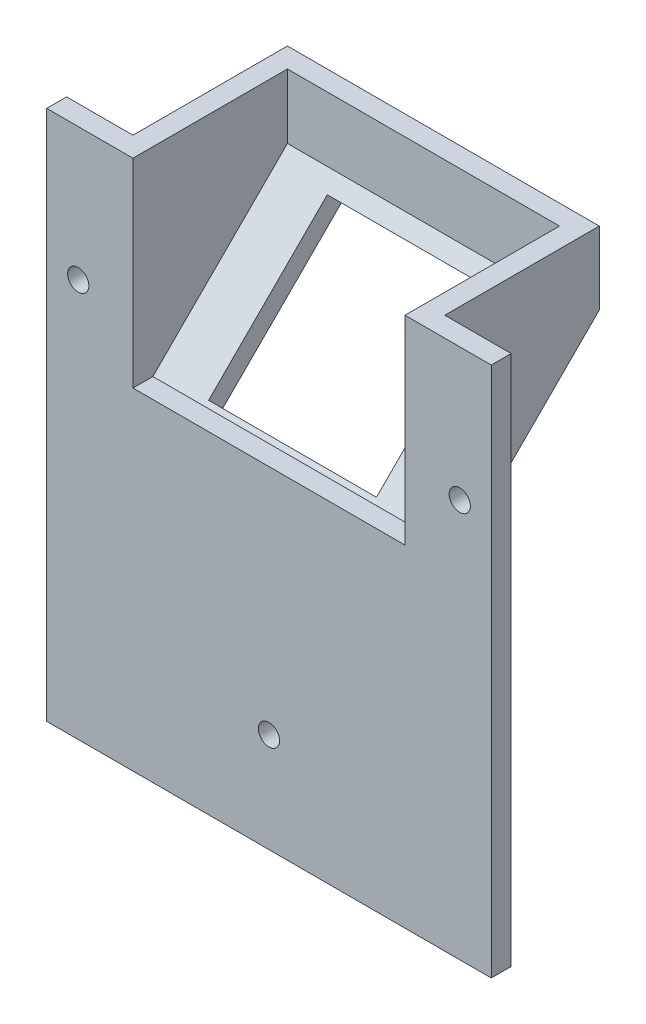
ISO-10303-21;
HEADER;
FILE_DESCRIPTION(('STEP AP214'),'2;1');
FILE_NAME('part.step','',(''),(''),'','','');
FILE_SCHEMA(('AUTOMOTIVE_DESIGN { 1 0 10303 214 1 1 1 1 }'));
ENDSEC;
DATA;
#1=APPLICATION_CONTEXT('core data for automotive mechanical design processes');
#2=APPLICATION_PROTOCOL_DEFINITION('international standard','automotive_design',2000,#1);
#3=PRODUCT_CONTEXT('',#1,'mechanical');
#4=PRODUCT('Part','Part','',(#3));
#5=PRODUCT_RELATED_PRODUCT_CATEGORY('part','',(#4));
#6=PRODUCT_DEFINITION_FORMATION('','',#4);
#7=PRODUCT_DEFINITION_CONTEXT('part definition',#1,'design');
#8=PRODUCT_DEFINITION('design','',#6,#7);
#9=PRODUCT_DEFINITION_SHAPE('','',#8);
#10=(LENGTH_UNIT() NAMED_UNIT(*) SI_UNIT(.MILLI.,.METRE.));
#11=(NAMED_UNIT(*) PLANE_ANGLE_UNIT() SI_UNIT($,.RADIAN.));
#12=(NAMED_UNIT(*) SI_UNIT($,.STERADIAN.) SOLID_ANGLE_UNIT());
#13=UNCERTAINTY_MEASURE_WITH_UNIT(LENGTH_MEASURE(1.E-05),#10,'distance_accuracy_value','');
#14=(GEOMETRIC_REPRESENTATION_CONTEXT(3) GLOBAL_UNCERTAINTY_ASSIGNED_CONTEXT((#13)) GLOBAL_UNIT_ASSIGNED_CONTEXT((#10,
#11,#12)) REPRESENTATION_CONTEXT('',''));
#15=CARTESIAN_POINT('',(0.,0.,0.));
#16=DIRECTION('',(0.,0.,1.));
#17=DIRECTION('',(1.,0.,0.));
#18=AXIS2_PLACEMENT_3D('',#15,#16,#17);
#19=CARTESIAN_POINT('',(13.,0.,0.));
#20=DIRECTION('',(1.,0.,0.));
#21=DIRECTION('',(0.,1.,0.));
#22=AXIS2_PLACEMENT_3D('',#19,#20,#21);
#23=PLANE('',#22);
#24=DIRECTION('',(0.,1.,0.));
#25=VECTOR('',#24,1.);
#26=CARTESIAN_POINT('',(13.,0.,3.));
#27=LINE('',#26,#25);
#28=CARTESIAN_POINT('',(13.,50.,3.));
#29=VERTEX_POINT('',#28);
#30=CARTESIAN_POINT('',(13.,80.,3.));
#31=VERTEX_POINT('',#30);
#32=EDGE_CURVE('E326',#29,#31,#27,.T.);
#33=ORIENTED_EDGE('',*,*,#32,.F.);
#34=DIRECTION('',(0.,0.,-1.));
#35=VECTOR('',#34,1.);
#36=CARTESIAN_POINT('',(13.,50.,0.));
#37=LINE('',#36,#35);
#38=CARTESIAN_POINT('',(13.,50.,0.));
#39=VERTEX_POINT('',#38);
#40=EDGE_CURVE('E301',#29,#39,#37,.T.);
#41=ORIENTED_EDGE('',*,*,#40,.T.);
#42=DIRECTION('',(0.,-0.707106781186557,0.707106781186538));
#43=VECTOR('',#42,1.);
#44=CARTESIAN_POINT('',(13.,70.2805625520103,-20.2805625520097));
#45=LINE('',#44,#43);
#46=CARTESIAN_POINT('',(13.,70.2805625520103,-20.2805625520097));
#47=VERTEX_POINT('',#46);
#48=EDGE_CURVE('E308',#47,#39,#45,.T.);
#49=ORIENTED_EDGE('',*,*,#48,.F.);
#50=DIRECTION('',(0.,-1.,0.));
#51=VECTOR('',#50,1.);
#52=CARTESIAN_POINT('',(13.,80.,-20.2805625520097));
#53=LINE('',#52,#51);
#54=CARTESIAN_POINT('',(13.,80.,-20.2805625520097));
#55=VERTEX_POINT('',#54);
#56=EDGE_CURVE('E305',#55,#47,#53,.T.);
#57=ORIENTED_EDGE('',*,*,#56,.F.);
#58=DIRECTION('',(0.,0.,-1.));
#59=VECTOR('',#58,1.);
#60=CARTESIAN_POINT('',(13.,80.,0.));
#61=LINE('',#60,#59);
#62=EDGE_CURVE('E328',#31,#55,#61,.T.);
#63=ORIENTED_EDGE('',*,*,#62,.F.);
#64=EDGE_LOOP('',(#33,#41,#49,#57,#63));
#65=FACE_BOUND('',#64,.T.);
#66=ADVANCED_FACE('F82',(#65),#23,.T.);
#67=CARTESIAN_POINT('',(13.,0.,3.));
#68=DIRECTION('',(0.,0.,1.));
#69=DIRECTION('',(1.,0.,0.));
#70=AXIS2_PLACEMENT_3D('',#67,#68,#69);
#71=PLANE('',#70);
#72=CARTESIAN_POINT('',(4.75,60.,3.));
#73=DIRECTION('',(0.,0.,1.));
#74=DIRECTION('',(1.,0.,0.));
#75=AXIS2_PLACEMENT_3D('',#72,#73,#74);
#76=CIRCLE('',#75,1.6);
#77=CARTESIAN_POINT('',(6.35,60.,3.));
#78=VERTEX_POINT('',#77);
#79=EDGE_CURVE('E227',#78,#78,#76,.T.);
#80=ORIENTED_EDGE('',*,*,#79,.F.);
#81=EDGE_LOOP('',(#80));
#82=FACE_BOUND('',#81,.T.);
#83=CARTESIAN_POINT('',(33.5,15.,3.));
#84=DIRECTION('',(0.,0.,1.));
#85=DIRECTION('',(1.,0.,0.));
#86=AXIS2_PLACEMENT_3D('',#83,#84,#85);
#87=CIRCLE('',#86,1.6);
#88=CARTESIAN_POINT('',(35.1,15.,3.));
#89=VERTEX_POINT('',#88);
#90=EDGE_CURVE('E233',#89,#89,#87,.T.);
#91=ORIENTED_EDGE('',*,*,#90,.F.);
#92=EDGE_LOOP('',(#91));
#93=FACE_BOUND('',#92,.T.);
#94=CARTESIAN_POINT('',(62.25,60.,3.));
#95=DIRECTION('',(0.,0.,1.));
#96=DIRECTION('',(1.,0.,0.));
#97=AXIS2_PLACEMENT_3D('',#94,#95,#96);
#98=CIRCLE('',#97,1.6);
#99=CARTESIAN_POINT('',(63.85,60.,3.));
#100=VERTEX_POINT('',#99);
#101=EDGE_CURVE('E239',#100,#100,#98,.T.);
#102=ORIENTED_EDGE('',*,*,#101,.F.);
#103=EDGE_LOOP('',(#102));
#104=FACE_BOUND('',#103,.T.);
#105=DIRECTION('',(-1.,0.,0.));
#106=VECTOR('',#105,1.);
#107=CARTESIAN_POINT('',(9.99999999999998,50.,3.));
#108=LINE('',#107,#106);
#109=CARTESIAN_POINT('',(54.,50.,3.));
#110=VERTEX_POINT('',#109);
#111=EDGE_CURVE('E271',#110,#29,#108,.T.);
#112=ORIENTED_EDGE('',*,*,#111,.T.);
#113=ORIENTED_EDGE('',*,*,#32,.T.);
#114=DIRECTION('',(-1.,0.,0.));
#115=VECTOR('',#114,1.);
#116=CARTESIAN_POINT('',(13.,80.,3.));
#117=LINE('',#116,#115);
#118=CARTESIAN_POINT('',(0.,80.,3.));
#119=VERTEX_POINT('',#118);
#120=EDGE_CURVE('E312',#31,#119,#117,.T.);
#121=ORIENTED_EDGE('',*,*,#120,.T.);
#122=DIRECTION('',(0.,-1.,0.));
#123=VECTOR('',#122,1.);
#124=CARTESIAN_POINT('',(0.,0.,3.));
#125=LINE('',#124,#123);
#126=CARTESIAN_POINT('',(0.,0.,3.));
#127=VERTEX_POINT('',#126);
#128=EDGE_CURVE('E262',#119,#127,#125,.T.);
#129=ORIENTED_EDGE('',*,*,#128,.T.);
#130=DIRECTION('',(1.,0.,0.));
#131=VECTOR('',#130,1.);
#132=CARTESIAN_POINT('',(67.,0.,3.));
#133=LINE('',#132,#131);
#134=CARTESIAN_POINT('',(67.,0.,3.));
#135=VERTEX_POINT('',#134);
#136=EDGE_CURVE('E264',#127,#135,#133,.T.);
#137=ORIENTED_EDGE('',*,*,#136,.T.);
#138=DIRECTION('',(0.,1.,0.));
#139=VECTOR('',#138,1.);
#140=CARTESIAN_POINT('',(67.,0.,3.));
#141=LINE('',#140,#139);
#142=CARTESIAN_POINT('',(67.,80.,3.));
#143=VERTEX_POINT('',#142);
#144=EDGE_CURVE('E267',#135,#143,#141,.T.);
#145=ORIENTED_EDGE('',*,*,#144,.T.);
#146=DIRECTION('',(-1.,0.,0.));
#147=VECTOR('',#146,1.);
#148=CARTESIAN_POINT('',(67.,80.,3.));
#149=LINE('',#148,#147);
#150=CARTESIAN_POINT('',(54.,80.,3.));
#151=VERTEX_POINT('',#150);
#152=EDGE_CURVE('E269',#143,#151,#149,.T.);
#153=ORIENTED_EDGE('',*,*,#152,.T.);
#154=DIRECTION('',(0.,1.,0.));
#155=VECTOR('',#154,1.);
#156=CARTESIAN_POINT('',(54.,45.757359312881,3.));
#157=LINE('',#156,#155);
#158=EDGE_CURVE('E246',#110,#151,#157,.T.);
#159=ORIENTED_EDGE('',*,*,#158,.F.);
#160=EDGE_LOOP('',(#112,#113,#121,#129,#137,#145,#153,#159));
#161=FACE_BOUND('',#160,.T.);
#162=ADVANCED_FACE('F84',(#82,#93,#104,#161),#71,.T.);
#163=CARTESIAN_POINT('',(9.99999999999999,0.,0.));
#164=DIRECTION('',(1.,0.,0.));
#165=DIRECTION('',(0.,1.,0.));
#166=AXIS2_PLACEMENT_3D('',#163,#164,#165);
#167=PLANE('',#166);
#168=DIRECTION('',(0.,-0.707106781186551,0.707106781186544));
#169=VECTOR('',#168,1.);
#170=CARTESIAN_POINT('',(9.99999999999999,22.8786796564403,22.8786796564405));
#171=LINE('',#170,#169);
#172=CARTESIAN_POINT('',(9.99999999999998,69.037921864891,-23.2805625520097));
#173=VERTEX_POINT('',#172);
#174=CARTESIAN_POINT('',(9.99999999999998,45.757359312881,0.));
#175=VERTEX_POINT('',#174);
#176=EDGE_CURVE('E333',#173,#175,#171,.T.);
#177=ORIENTED_EDGE('',*,*,#176,.T.);
#178=DIRECTION('',(0.,1.,0.));
#179=VECTOR('',#178,1.);
#180=CARTESIAN_POINT('',(9.99999999999998,80.,0.));
#181=LINE('',#180,#179);
#182=CARTESIAN_POINT('',(9.99999999999998,80.,0.));
#183=VERTEX_POINT('',#182);
#184=EDGE_CURVE('E265',#175,#183,#181,.T.);
#185=ORIENTED_EDGE('',*,*,#184,.T.);
#186=DIRECTION('',(0.,0.,-1.));
#187=VECTOR('',#186,1.);
#188=CARTESIAN_POINT('',(9.99999999999998,80.,0.));
#189=LINE('',#188,#187);
#190=CARTESIAN_POINT('',(9.99999999999998,80.,-23.2805625520097));
#191=VERTEX_POINT('',#190);
#192=EDGE_CURVE('E329',#183,#191,#189,.T.);
#193=ORIENTED_EDGE('',*,*,#192,.T.);
#194=DIRECTION('',(0.,-1.,0.));
#195=VECTOR('',#194,1.);
#196=CARTESIAN_POINT('',(9.99999999999999,0.,-23.2805625520098));
#197=LINE('',#196,#195);
#198=EDGE_CURVE('E336',#191,#173,#197,.T.);
#199=ORIENTED_EDGE('',*,*,#198,.T.);
#200=EDGE_LOOP('',(#177,#185,#193,#199));
#201=FACE_BOUND('',#200,.T.);
#202=ADVANCED_FACE('F376',(#201),#167,.F.);
#203=CARTESIAN_POINT('',(13.,80.,0.));
#204=DIRECTION('',(0.,1.,0.));
#205=DIRECTION('',(-1.,0.,0.));
#206=AXIS2_PLACEMENT_3D('',#203,#204,#205);
#207=PLANE('',#206);
#208=ORIENTED_EDGE('',*,*,#192,.F.);
#209=DIRECTION('',(-1.,0.,0.));
#210=VECTOR('',#209,1.);
#211=CARTESIAN_POINT('',(9.99999999999998,80.,0.));
#212=LINE('',#211,#210);
#213=CARTESIAN_POINT('',(0.,80.,0.));
#214=VERTEX_POINT('',#213);
#215=EDGE_CURVE('E261',#183,#214,#212,.T.);
#216=ORIENTED_EDGE('',*,*,#215,.T.);
#217=DIRECTION('',(0.,0.,-1.));
#218=VECTOR('',#217,1.);
#219=CARTESIAN_POINT('',(0.,80.,3.));
#220=LINE('',#219,#218);
#221=EDGE_CURVE('E298',#119,#214,#220,.T.);
#222=ORIENTED_EDGE('',*,*,#221,.F.);
#223=ORIENTED_EDGE('',*,*,#120,.F.);
#224=ORIENTED_EDGE('',*,*,#62,.T.);
#225=DIRECTION('',(1.,0.,0.));
#226=VECTOR('',#225,1.);
#227=CARTESIAN_POINT('',(-28.4070408742906,80.,-20.2805625520097));
#228=LINE('',#227,#226);
#229=CARTESIAN_POINT('',(54.,80.,-20.2805625520097));
#230=VERTEX_POINT('',#229);
#231=EDGE_CURVE('E318',#55,#230,#228,.T.);
#232=ORIENTED_EDGE('',*,*,#231,.T.);
#233=DIRECTION('',(0.,0.,-1.));
#234=VECTOR('',#233,1.);
#235=CARTESIAN_POINT('',(54.,80.,3.));
#236=LINE('',#235,#234);
#237=EDGE_CURVE('E249',#151,#230,#236,.T.);
#238=ORIENTED_EDGE('',*,*,#237,.F.);
#239=ORIENTED_EDGE('',*,*,#152,.F.);
#240=DIRECTION('',(0.,0.,-1.));
#241=VECTOR('',#240,1.);
#242=CARTESIAN_POINT('',(67.,80.,3.));
#243=LINE('',#242,#241);
#244=CARTESIAN_POINT('',(67.,80.,0.));
#245=VERTEX_POINT('',#244);
#246=EDGE_CURVE('E274',#143,#245,#243,.T.);
#247=ORIENTED_EDGE('',*,*,#246,.T.);
#248=DIRECTION('',(-1.,0.,0.));
#249=VECTOR('',#248,1.);
#250=CARTESIAN_POINT('',(67.,80.,0.));
#251=LINE('',#250,#249);
#252=CARTESIAN_POINT('',(57.,80.,0.));
#253=VERTEX_POINT('',#252);
#254=EDGE_CURVE('E283',#245,#253,#251,.T.);
#255=ORIENTED_EDGE('',*,*,#254,.T.);
#256=DIRECTION('',(0.,0.,-1.));
#257=VECTOR('',#256,1.);
#258=CARTESIAN_POINT('',(57.,80.,3.));
#259=LINE('',#258,#257);
#260=CARTESIAN_POINT('',(57.,80.,-23.2805625520097));
#261=VERTEX_POINT('',#260);
#262=EDGE_CURVE('E245',#253,#261,#259,.T.);
#263=ORIENTED_EDGE('',*,*,#262,.T.);
#264=DIRECTION('',(-1.,0.,0.));
#265=VECTOR('',#264,1.);
#266=CARTESIAN_POINT('',(13.,80.,-23.2805625520097));
#267=LINE('',#266,#265);
#268=EDGE_CURVE('E332',#261,#191,#267,.T.);
#269=ORIENTED_EDGE('',*,*,#268,.T.);
#270=EDGE_LOOP('',(#208,#216,#222,#223,#224,#232,#238,#239,#247,#255,#263,#269));
#271=FACE_BOUND('',#270,.T.);
#272=ADVANCED_FACE('F381',(#271),#207,.T.);
#273=CARTESIAN_POINT('',(13.,0.,-23.2805625520098));
#274=DIRECTION('',(0.,0.,-1.));
#275=DIRECTION('',(0.,1.,0.));
#276=AXIS2_PLACEMENT_3D('',#273,#274,#275);
#277=PLANE('',#276);
#278=ORIENTED_EDGE('',*,*,#198,.F.);
#279=ORIENTED_EDGE('',*,*,#268,.F.);
#280=DIRECTION('',(0.,-1.,0.));
#281=VECTOR('',#280,1.);
#282=CARTESIAN_POINT('',(57.,80.,-23.2805625520097));
#283=LINE('',#282,#281);
#284=CARTESIAN_POINT('',(57.,69.037921864891,-23.2805625520097));
#285=VERTEX_POINT('',#284);
#286=EDGE_CURVE('E255',#261,#285,#283,.T.);
#287=ORIENTED_EDGE('',*,*,#286,.T.);
#288=DIRECTION('',(-1.,0.,0.));
#289=VECTOR('',#288,1.);
#290=CARTESIAN_POINT('',(13.,69.037921864891,-23.2805625520097));
#291=LINE('',#290,#289);
#292=EDGE_CURVE('E342',#285,#173,#291,.T.);
#293=ORIENTED_EDGE('',*,*,#292,.T.);
#294=EDGE_LOOP('',(#278,#279,#287,#293));
#295=FACE_BOUND('',#294,.T.);
#296=ADVANCED_FACE('F390',(#295),#277,.T.);
#297=CARTESIAN_POINT('',(13.,22.8786796564403,22.8786796564405));
#298=DIRECTION('',(0.,-0.707106781186544,-0.707106781186551));
#299=DIRECTION('',(0.,0.707106781186551,-0.707106781186544));
#300=AXIS2_PLACEMENT_3D('',#297,#298,#299);
#301=PLANE('',#300);
#302=DIRECTION('',(0.,0.707106781186551,-0.707106781186544));
#303=VECTOR('',#302,1.);
#304=CARTESIAN_POINT('',(20.85,48.425759193303,-2.66839988042196));
#305=LINE('',#304,#303);
#306=CARTESIAN_POINT('',(20.85,48.425759193303,-2.66839988042196));
#307=VERTEX_POINT('',#306);
#308=CARTESIAN_POINT('',(20.85,66.3155607573228,-20.5582014444415));
#309=VERTEX_POINT('',#308);
#310=EDGE_CURVE('E97',#307,#309,#305,.T.);
#311=ORIENTED_EDGE('',*,*,#310,.F.);
#312=DIRECTION('',(-1.,0.,0.));
#313=VECTOR('',#312,1.);
#314=CARTESIAN_POINT('',(46.15,48.425759193303,-2.66839988042195));
#315=LINE('',#314,#313);
#316=CARTESIAN_POINT('',(46.15,48.425759193303,-2.66839988042195));
#317=VERTEX_POINT('',#316);
#318=EDGE_CURVE('E220',#317,#307,#315,.T.);
#319=ORIENTED_EDGE('',*,*,#318,.F.);
#320=DIRECTION('',(0.,-0.707106781186551,0.707106781186544));
#321=VECTOR('',#320,1.);
#322=CARTESIAN_POINT('',(46.15,48.425759193303,-2.66839988042195));
#323=LINE('',#322,#321);
#324=CARTESIAN_POINT('',(46.15,66.3155607573228,-20.5582014444415));
#325=VERTEX_POINT('',#324);
#326=EDGE_CURVE('E204',#325,#317,#323,.T.);
#327=ORIENTED_EDGE('',*,*,#326,.F.);
#328=DIRECTION('',(1.,0.,0.));
#329=VECTOR('',#328,1.);
#330=CARTESIAN_POINT('',(46.15,66.3155607573228,-20.5582014444415));
#331=LINE('',#330,#329);
#332=EDGE_CURVE('E213',#309,#325,#331,.T.);
#333=ORIENTED_EDGE('',*,*,#332,.F.);
#334=EDGE_LOOP('',(#311,#319,#327,#333));
#335=FACE_BOUND('',#334,.T.);
#336=ORIENTED_EDGE('',*,*,#176,.F.);
#337=ORIENTED_EDGE('',*,*,#292,.F.);
#338=DIRECTION('',(0.,-0.707106781186551,0.707106781186544));
#339=VECTOR('',#338,1.);
#340=CARTESIAN_POINT('',(57.,69.037921864891,-23.2805625520097));
#341=LINE('',#340,#339);
#342=CARTESIAN_POINT('',(57.,45.757359312881,0.));
#343=VERTEX_POINT('',#342);
#344=EDGE_CURVE('E250',#285,#343,#341,.T.);
#345=ORIENTED_EDGE('',*,*,#344,.T.);
#346=DIRECTION('',(-1.,0.,0.));
#347=VECTOR('',#346,1.);
#348=CARTESIAN_POINT('',(13.,45.757359312881,0.));
#349=LINE('',#348,#347);
#350=EDGE_CURVE('E344',#343,#175,#349,.T.);
#351=ORIENTED_EDGE('',*,*,#350,.T.);
#352=EDGE_LOOP('',(#336,#337,#345,#351));
#353=FACE_BOUND('',#352,.T.);
#354=ADVANCED_FACE('F217',(#335,#353),#301,.T.);
#355=CARTESIAN_POINT('',(-28.4070408742906,80.,-20.2805625520097));
#356=DIRECTION('',(0.,0.,-1.));
#357=DIRECTION('',(-1.,0.,0.));
#358=AXIS2_PLACEMENT_3D('',#355,#356,#357);
#359=PLANE('',#358);
#360=ORIENTED_EDGE('',*,*,#231,.F.);
#361=ORIENTED_EDGE('',*,*,#56,.T.);
#362=DIRECTION('',(1.,0.,0.));
#363=VECTOR('',#362,1.);
#364=CARTESIAN_POINT('',(-28.4070408742906,70.2805625520103,-20.2805625520097));
#365=LINE('',#364,#363);
#366=CARTESIAN_POINT('',(54.,70.2805625520103,-20.2805625520097));
#367=VERTEX_POINT('',#366);
#368=EDGE_CURVE('E321',#47,#367,#365,.T.);
#369=ORIENTED_EDGE('',*,*,#368,.T.);
#370=DIRECTION('',(0.,1.,0.));
#371=VECTOR('',#370,1.);
#372=CARTESIAN_POINT('',(54.,80.,-20.2805625520097));
#373=LINE('',#372,#371);
#374=EDGE_CURVE('E315',#367,#230,#373,.T.);
#375=ORIENTED_EDGE('',*,*,#374,.T.);
#376=EDGE_LOOP('',(#360,#361,#369,#375));
#377=FACE_BOUND('',#376,.T.);
#378=ADVANCED_FACE('F397',(#377),#359,.F.);
#379=CARTESIAN_POINT('',(-28.4070408742906,70.2805625520103,-20.2805625520097));
#380=DIRECTION('',(0.,-0.707106781186538,-0.707106781186557));
#381=DIRECTION('',(0.,0.707106781186557,-0.707106781186538));
#382=AXIS2_PLACEMENT_3D('',#379,#380,#381);
#383=PLANE('',#382);
#384=DIRECTION('',(-1.,0.,0.));
#385=VECTOR('',#384,1.);
#386=CARTESIAN_POINT('',(-28.4070408742906,50.5470795368625,-0.547079536862484));
#387=LINE('',#386,#385);
#388=CARTESIAN_POINT('',(46.15,50.5470795368625,-0.547079536862455));
#389=VERTEX_POINT('',#388);
#390=CARTESIAN_POINT('',(20.85,50.5470795368625,-0.547079536862467));
#391=VERTEX_POINT('',#390);
#392=EDGE_CURVE('E90',#389,#391,#387,.T.);
#393=ORIENTED_EDGE('',*,*,#392,.T.);
#394=DIRECTION('',(0.,0.707106781186557,-0.707106781186538));
#395=VECTOR('',#394,1.);
#396=CARTESIAN_POINT('',(20.85,70.2805625520103,-20.2805625520097));
#397=LINE('',#396,#395);
#398=CARTESIAN_POINT('',(20.85,68.4368811008824,-18.4368811008819));
#399=VERTEX_POINT('',#398);
#400=EDGE_CURVE('E12',#391,#399,#397,.T.);
#401=ORIENTED_EDGE('',*,*,#400,.T.);
#402=DIRECTION('',(1.,0.,0.));
#403=VECTOR('',#402,1.);
#404=CARTESIAN_POINT('',(-28.4070408742906,68.4368811008824,-18.4368811008819));
#405=LINE('',#404,#403);
#406=CARTESIAN_POINT('',(46.15,68.4368811008824,-18.4368811008819));
#407=VERTEX_POINT('',#406);
#408=EDGE_CURVE('E347',#399,#407,#405,.T.);
#409=ORIENTED_EDGE('',*,*,#408,.T.);
#410=DIRECTION('',(0.,-0.707106781186557,0.707106781186538));
#411=VECTOR('',#410,1.);
#412=CARTESIAN_POINT('',(46.15,70.2805625520103,-20.2805625520097));
#413=LINE('',#412,#411);
#414=EDGE_CURVE('E207',#407,#389,#413,.T.);
#415=ORIENTED_EDGE('',*,*,#414,.T.);
#416=EDGE_LOOP('',(#393,#401,#409,#415));
#417=FACE_BOUND('',#416,.T.);
#418=ORIENTED_EDGE('',*,*,#368,.F.);
#419=ORIENTED_EDGE('',*,*,#48,.T.);
#420=DIRECTION('',(1.,0.,0.));
#421=VECTOR('',#420,1.);
#422=CARTESIAN_POINT('',(-28.4070408742906,50.,0.));
#423=LINE('',#422,#421);
#424=CARTESIAN_POINT('',(54.,50.,0.));
#425=VERTEX_POINT('',#424);
#426=EDGE_CURVE('E309',#39,#425,#423,.T.);
#427=ORIENTED_EDGE('',*,*,#426,.T.);
#428=DIRECTION('',(0.,0.707106781186557,-0.707106781186538));
#429=VECTOR('',#428,1.);
#430=CARTESIAN_POINT('',(54.,70.2805625520103,-20.2805625520097));
#431=LINE('',#430,#429);
#432=EDGE_CURVE('E304',#425,#367,#431,.T.);
#433=ORIENTED_EDGE('',*,*,#432,.T.);
#434=EDGE_LOOP('',(#418,#419,#427,#433));
#435=FACE_BOUND('',#434,.T.);
#436=ADVANCED_FACE('F354',(#417,#435),#383,.F.);
#437=CARTESIAN_POINT('',(0.,0.,0.));
#438=DIRECTION('',(0.,0.,-1.));
#439=DIRECTION('',(-1.,0.,0.));
#440=AXIS2_PLACEMENT_3D('',#437,#438,#439);
#441=PLANE('',#440);
#442=CARTESIAN_POINT('',(4.75,60.,0.));
#443=DIRECTION('',(0.,0.,-1.));
#444=DIRECTION('',(-1.,0.,0.));
#445=AXIS2_PLACEMENT_3D('',#442,#443,#444);
#446=CIRCLE('',#445,1.6);
#447=CARTESIAN_POINT('',(3.15,60.,0.));
#448=VERTEX_POINT('',#447);
#449=EDGE_CURVE('E232',#448,#448,#446,.T.);
#450=ORIENTED_EDGE('',*,*,#449,.F.);
#451=EDGE_LOOP('',(#450));
#452=FACE_BOUND('',#451,.T.);
#453=CARTESIAN_POINT('',(33.5,15.,0.));
#454=DIRECTION('',(0.,0.,-1.));
#455=DIRECTION('',(-1.,0.,0.));
#456=AXIS2_PLACEMENT_3D('',#453,#454,#455);
#457=CIRCLE('',#456,1.6);
#458=CARTESIAN_POINT('',(31.9,15.,0.));
#459=VERTEX_POINT('',#458);
#460=EDGE_CURVE('E236',#459,#459,#457,.T.);
#461=ORIENTED_EDGE('',*,*,#460,.F.);
#462=EDGE_LOOP('',(#461));
#463=FACE_BOUND('',#462,.T.);
#464=CARTESIAN_POINT('',(62.25,60.,0.));
#465=DIRECTION('',(0.,0.,-1.));
#466=DIRECTION('',(-1.,0.,0.));
#467=AXIS2_PLACEMENT_3D('',#464,#465,#466);
#468=CIRCLE('',#467,1.6);
#469=CARTESIAN_POINT('',(60.65,60.,0.));
#470=VERTEX_POINT('',#469);
#471=EDGE_CURVE('E242',#470,#470,#468,.T.);
#472=ORIENTED_EDGE('',*,*,#471,.F.);
#473=EDGE_LOOP('',(#472));
#474=FACE_BOUND('',#473,.T.);
#475=ORIENTED_EDGE('',*,*,#184,.F.);
#476=ORIENTED_EDGE('',*,*,#350,.F.);
#477=DIRECTION('',(0.,-1.,0.));
#478=VECTOR('',#477,1.);
#479=CARTESIAN_POINT('',(57.,50.,0.));
#480=LINE('',#479,#478);
#481=EDGE_CURVE('E285',#253,#343,#480,.T.);
#482=ORIENTED_EDGE('',*,*,#481,.F.);
#483=ORIENTED_EDGE('',*,*,#254,.F.);
#484=DIRECTION('',(0.,1.,0.));
#485=VECTOR('',#484,1.);
#486=CARTESIAN_POINT('',(67.,0.,0.));
#487=LINE('',#486,#485);
#488=CARTESIAN_POINT('',(67.,0.,0.));
#489=VERTEX_POINT('',#488);
#490=EDGE_CURVE('E281',#489,#245,#487,.T.);
#491=ORIENTED_EDGE('',*,*,#490,.F.);
#492=DIRECTION('',(1.,0.,0.));
#493=VECTOR('',#492,1.);
#494=CARTESIAN_POINT('',(67.,0.,0.));
#495=LINE('',#494,#493);
#496=CARTESIAN_POINT('',(0.,0.,0.));
#497=VERTEX_POINT('',#496);
#498=EDGE_CURVE('E279',#497,#489,#495,.T.);
#499=ORIENTED_EDGE('',*,*,#498,.F.);
#500=DIRECTION('',(0.,-1.,0.));
#501=VECTOR('',#500,1.);
#502=CARTESIAN_POINT('',(0.,0.,0.));
#503=LINE('',#502,#501);
#504=EDGE_CURVE('E277',#214,#497,#503,.T.);
#505=ORIENTED_EDGE('',*,*,#504,.F.);
#506=ORIENTED_EDGE('',*,*,#215,.F.);
#507=EDGE_LOOP('',(#475,#476,#482,#483,#491,#499,#505,#506));
#508=FACE_BOUND('',#507,.T.);
#509=ADVANCED_FACE('F406',(#452,#463,#474,#508),#441,.T.);
#510=CARTESIAN_POINT('',(54.,0.,0.));
#511=DIRECTION('',(-1.,0.,0.));
#512=DIRECTION('',(0.,0.,1.));
#513=AXIS2_PLACEMENT_3D('',#510,#511,#512);
#514=PLANE('',#513);
#515=ORIENTED_EDGE('',*,*,#374,.F.);
#516=ORIENTED_EDGE('',*,*,#432,.F.);
#517=DIRECTION('',(0.,0.,-1.));
#518=VECTOR('',#517,1.);
#519=CARTESIAN_POINT('',(54.,50.,3.));
#520=LINE('',#519,#518);
#521=EDGE_CURVE('E252',#110,#425,#520,.T.);
#522=ORIENTED_EDGE('',*,*,#521,.F.);
#523=ORIENTED_EDGE('',*,*,#158,.T.);
#524=ORIENTED_EDGE('',*,*,#237,.T.);
#525=EDGE_LOOP('',(#515,#516,#522,#523,#524));
#526=FACE_BOUND('',#525,.T.);
#527=ADVANCED_FACE('F413',(#526),#514,.T.);
#528=CARTESIAN_POINT('',(0.,0.,3.));
#529=DIRECTION('',(1.,0.,0.));
#530=DIRECTION('',(0.,0.,-1.));
#531=AXIS2_PLACEMENT_3D('',#528,#529,#530);
#532=PLANE('',#531);
#533=ORIENTED_EDGE('',*,*,#504,.T.);
#534=DIRECTION('',(0.,0.,-1.));
#535=VECTOR('',#534,1.);
#536=CARTESIAN_POINT('',(0.,0.,3.));
#537=LINE('',#536,#535);
#538=EDGE_CURVE('E295',#127,#497,#537,.T.);
#539=ORIENTED_EDGE('',*,*,#538,.F.);
#540=ORIENTED_EDGE('',*,*,#128,.F.);
#541=ORIENTED_EDGE('',*,*,#221,.T.);
#542=EDGE_LOOP('',(#533,#539,#540,#541));
#543=FACE_BOUND('',#542,.T.);
#544=ADVANCED_FACE('F409',(#543),#532,.F.);
#545=CARTESIAN_POINT('',(67.,0.,3.));
#546=DIRECTION('',(0.,1.,0.));
#547=DIRECTION('',(-1.,0.,0.));
#548=AXIS2_PLACEMENT_3D('',#545,#546,#547);
#549=PLANE('',#548);
#550=ORIENTED_EDGE('',*,*,#498,.T.);
#551=DIRECTION('',(0.,0.,-1.));
#552=VECTOR('',#551,1.);
#553=CARTESIAN_POINT('',(67.,0.,3.));
#554=LINE('',#553,#552);
#555=EDGE_CURVE('E292',#135,#489,#554,.T.);
#556=ORIENTED_EDGE('',*,*,#555,.F.);
#557=ORIENTED_EDGE('',*,*,#136,.F.);
#558=ORIENTED_EDGE('',*,*,#538,.T.);
#559=EDGE_LOOP('',(#550,#556,#557,#558));
#560=FACE_BOUND('',#559,.T.);
#561=ADVANCED_FACE('F412',(#560),#549,.F.);
#562=CARTESIAN_POINT('',(67.,0.,3.));
#563=DIRECTION('',(-1.,0.,0.));
#564=DIRECTION('',(0.,-1.,0.));
#565=AXIS2_PLACEMENT_3D('',#562,#563,#564);
#566=PLANE('',#565);
#567=ORIENTED_EDGE('',*,*,#490,.T.);
#568=ORIENTED_EDGE('',*,*,#246,.F.);
#569=ORIENTED_EDGE('',*,*,#144,.F.);
#570=ORIENTED_EDGE('',*,*,#555,.T.);
#571=EDGE_LOOP('',(#567,#568,#569,#570));
#572=FACE_BOUND('',#571,.T.);
#573=ADVANCED_FACE('F417',(#572),#566,.F.);
#574=CARTESIAN_POINT('',(9.99999999999998,50.,3.));
#575=DIRECTION('',(0.,-1.,0.));
#576=DIRECTION('',(0.,0.,-1.));
#577=AXIS2_PLACEMENT_3D('',#574,#575,#576);
#578=PLANE('',#577);
#579=ORIENTED_EDGE('',*,*,#40,.F.);
#580=ORIENTED_EDGE('',*,*,#111,.F.);
#581=ORIENTED_EDGE('',*,*,#521,.T.);
#582=ORIENTED_EDGE('',*,*,#426,.F.);
#583=EDGE_LOOP('',(#579,#580,#581,#582));
#584=FACE_BOUND('',#583,.T.);
#585=ADVANCED_FACE('F421',(#584),#578,.F.);
#586=CARTESIAN_POINT('',(57.,0.,0.));
#587=DIRECTION('',(-1.,0.,0.));
#588=DIRECTION('',(0.,0.,1.));
#589=AXIS2_PLACEMENT_3D('',#586,#587,#588);
#590=PLANE('',#589);
#591=ORIENTED_EDGE('',*,*,#481,.T.);
#592=ORIENTED_EDGE('',*,*,#344,.F.);
#593=ORIENTED_EDGE('',*,*,#286,.F.);
#594=ORIENTED_EDGE('',*,*,#262,.F.);
#595=EDGE_LOOP('',(#591,#592,#593,#594));
#596=FACE_BOUND('',#595,.T.);
#597=ADVANCED_FACE('F425',(#596),#590,.F.);
#598=CARTESIAN_POINT('',(62.25,60.,3.));
#599=DIRECTION('',(0.,0.,1.));
#600=DIRECTION('',(1.,0.,0.));
#601=AXIS2_PLACEMENT_3D('',#598,#599,#600);
#602=CYLINDRICAL_SURFACE('',#601,1.6);
#603=ORIENTED_EDGE('',*,*,#471,.T.);
#604=EDGE_LOOP('',(#603));
#605=FACE_BOUND('',#604,.T.);
#606=ORIENTED_EDGE('',*,*,#101,.T.);
#607=EDGE_LOOP('',(#606));
#608=FACE_BOUND('',#607,.T.);
#609=ADVANCED_FACE('F432',(#605,#608),#602,.F.);
#610=CARTESIAN_POINT('',(33.5,15.,3.));
#611=DIRECTION('',(0.,0.,1.));
#612=DIRECTION('',(1.,0.,0.));
#613=AXIS2_PLACEMENT_3D('',#610,#611,#612);
#614=CYLINDRICAL_SURFACE('',#613,1.6);
#615=ORIENTED_EDGE('',*,*,#460,.T.);
#616=EDGE_LOOP('',(#615));
#617=FACE_BOUND('',#616,.T.);
#618=ORIENTED_EDGE('',*,*,#90,.T.);
#619=EDGE_LOOP('',(#618));
#620=FACE_BOUND('',#619,.T.);
#621=ADVANCED_FACE('F369',(#617,#620),#614,.F.);
#622=CARTESIAN_POINT('',(4.75,60.,3.));
#623=DIRECTION('',(0.,0.,1.));
#624=DIRECTION('',(1.,0.,0.));
#625=AXIS2_PLACEMENT_3D('',#622,#623,#624);
#626=CYLINDRICAL_SURFACE('',#625,1.6);
#627=ORIENTED_EDGE('',*,*,#449,.T.);
#628=EDGE_LOOP('',(#627));
#629=FACE_BOUND('',#628,.T.);
#630=ORIENTED_EDGE('',*,*,#79,.T.);
#631=EDGE_LOOP('',(#630));
#632=FACE_BOUND('',#631,.T.);
#633=ADVANCED_FACE('F361',(#629,#632),#626,.F.);
#634=CARTESIAN_POINT('',(20.85,55.4968270051684,4.40266793144355));
#635=DIRECTION('',(-1.,0.,0.));
#636=DIRECTION('',(0.,0.,1.));
#637=AXIS2_PLACEMENT_3D('',#634,#635,#636);
#638=PLANE('',#637);
#639=DIRECTION('',(0.,-0.707106781186544,-0.707106781186551));
#640=VECTOR('',#639,1.);
#641=CARTESIAN_POINT('',(20.85,55.4968270051684,4.40266793144355));
#642=LINE('',#641,#640);
#643=EDGE_CURVE('E225',#391,#307,#642,.T.);
#644=ORIENTED_EDGE('',*,*,#643,.T.);
#645=ORIENTED_EDGE('',*,*,#310,.T.);
#646=DIRECTION('',(0.,-0.707106781186544,-0.707106781186551));
#647=VECTOR('',#646,1.);
#648=CARTESIAN_POINT('',(20.85,73.3866285691882,-13.487133632576));
#649=LINE('',#648,#647);
#650=EDGE_CURVE('E210',#399,#309,#649,.T.);
#651=ORIENTED_EDGE('',*,*,#650,.F.);
#652=ORIENTED_EDGE('',*,*,#400,.F.);
#653=EDGE_LOOP('',(#644,#645,#651,#652));
#654=FACE_BOUND('',#653,.T.);
#655=ADVANCED_FACE('F359',(#654),#638,.F.);
#656=CARTESIAN_POINT('',(46.15,55.4968270051684,4.40266793144356));
#657=DIRECTION('',(0.,-0.707106781186551,0.707106781186544));
#658=DIRECTION('',(0.,-0.707106781186544,-0.707106781186551));
#659=AXIS2_PLACEMENT_3D('',#656,#657,#658);
#660=PLANE('',#659);
#661=DIRECTION('',(0.,-0.707106781186544,-0.707106781186551));
#662=VECTOR('',#661,1.);
#663=CARTESIAN_POINT('',(46.15,55.4968270051684,4.40266793144356));
#664=LINE('',#663,#662);
#665=EDGE_CURVE('E209',#389,#317,#664,.T.);
#666=ORIENTED_EDGE('',*,*,#665,.T.);
#667=ORIENTED_EDGE('',*,*,#318,.T.);
#668=ORIENTED_EDGE('',*,*,#643,.F.);
#669=ORIENTED_EDGE('',*,*,#392,.F.);
#670=EDGE_LOOP('',(#666,#667,#668,#669));
#671=FACE_BOUND('',#670,.T.);
#672=ADVANCED_FACE('F358',(#671),#660,.F.);
#673=CARTESIAN_POINT('',(46.15,55.4968270051684,4.40266793144356));
#674=DIRECTION('',(1.,0.,0.));
#675=DIRECTION('',(0.,0.,-1.));
#676=AXIS2_PLACEMENT_3D('',#673,#674,#675);
#677=PLANE('',#676);
#678=DIRECTION('',(0.,-0.707106781186544,-0.707106781186551));
#679=VECTOR('',#678,1.);
#680=CARTESIAN_POINT('',(46.15,73.3866285691882,-13.487133632576));
#681=LINE('',#680,#679);
#682=EDGE_CURVE('E105',#407,#325,#681,.T.);
#683=ORIENTED_EDGE('',*,*,#682,.T.);
#684=ORIENTED_EDGE('',*,*,#326,.T.);
#685=ORIENTED_EDGE('',*,*,#665,.F.);
#686=ORIENTED_EDGE('',*,*,#414,.F.);
#687=EDGE_LOOP('',(#683,#684,#685,#686));
#688=FACE_BOUND('',#687,.T.);
#689=ADVANCED_FACE('F201',(#688),#677,.F.);
#690=CARTESIAN_POINT('',(46.15,73.3866285691882,-13.487133632576));
#691=DIRECTION('',(0.,0.707106781186551,-0.707106781186544));
#692=DIRECTION('',(0.,0.707106781186544,0.707106781186551));
#693=AXIS2_PLACEMENT_3D('',#690,#691,#692);
#694=PLANE('',#693);
#695=ORIENTED_EDGE('',*,*,#650,.T.);
#696=ORIENTED_EDGE('',*,*,#332,.T.);
#697=ORIENTED_EDGE('',*,*,#682,.F.);
#698=ORIENTED_EDGE('',*,*,#408,.F.);
#699=EDGE_LOOP('',(#695,#696,#697,#698));
#700=FACE_BOUND('',#699,.T.);
#701=ADVANCED_FACE('F214',(#700),#694,.F.);
#702=CLOSED_SHELL('',(#66,#162,#202,#272,#296,#354,#378,#436,#509,#527,#544,#561,#573,#585,#597,
#609,#621,#633,#655,#672,#689,#701));
#703=MANIFOLD_SOLID_BREP('B2',#702);
#704=ADVANCED_BREP_SHAPE_REPRESENTATION('',(#18,#703),#14);
#705=SHAPE_DEFINITION_REPRESENTATION(#9,#704);
ENDSEC;
END-ISO-10303-21;
